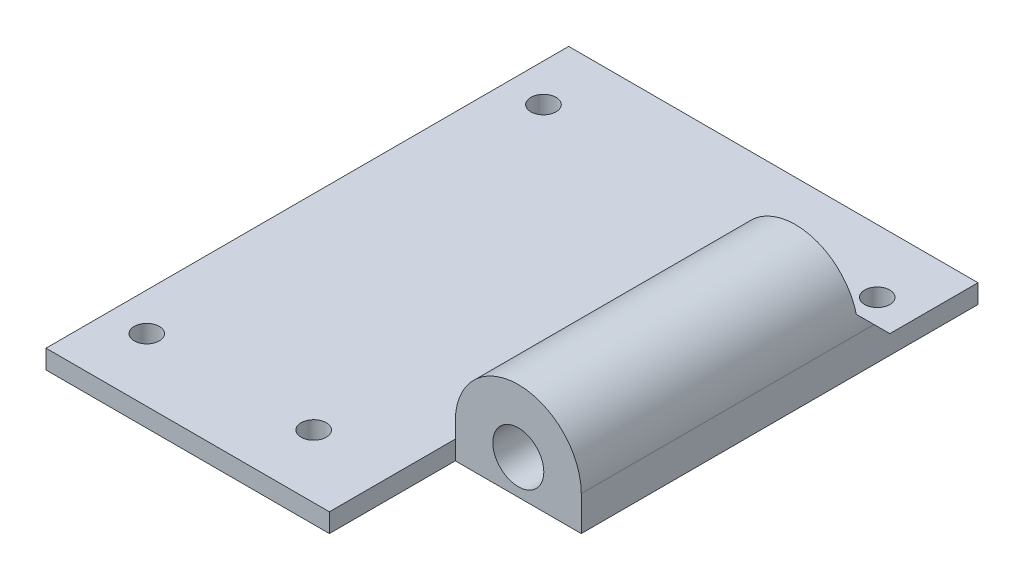
ISO-10303-21;
HEADER;
FILE_DESCRIPTION(('STEP AP214'),'2;1');
FILE_NAME('part.step','',(''),(''),'','','');
FILE_SCHEMA(('AUTOMOTIVE_DESIGN { 1 0 10303 214 1 1 1 1 }'));
ENDSEC;
DATA;
#1=APPLICATION_CONTEXT('core data for automotive mechanical design processes');
#2=APPLICATION_PROTOCOL_DEFINITION('international standard','automotive_design',2000,#1);
#3=PRODUCT_CONTEXT('',#1,'mechanical');
#4=PRODUCT('Part','Part','',(#3));
#5=PRODUCT_RELATED_PRODUCT_CATEGORY('part','',(#4));
#6=PRODUCT_DEFINITION_FORMATION('','',#4);
#7=PRODUCT_DEFINITION_CONTEXT('part definition',#1,'design');
#8=PRODUCT_DEFINITION('design','',#6,#7);
#9=PRODUCT_DEFINITION_SHAPE('','',#8);
#10=(LENGTH_UNIT() NAMED_UNIT(*) SI_UNIT(.MILLI.,.METRE.));
#11=(NAMED_UNIT(*) PLANE_ANGLE_UNIT() SI_UNIT($,.RADIAN.));
#12=(NAMED_UNIT(*) SI_UNIT($,.STERADIAN.) SOLID_ANGLE_UNIT());
#13=UNCERTAINTY_MEASURE_WITH_UNIT(LENGTH_MEASURE(1.E-05),#10,'distance_accuracy_value','');
#14=(GEOMETRIC_REPRESENTATION_CONTEXT(3) GLOBAL_UNCERTAINTY_ASSIGNED_CONTEXT((#13)) GLOBAL_UNIT_ASSIGNED_CONTEXT((#10,
#11,#12)) REPRESENTATION_CONTEXT('',''));
#15=CARTESIAN_POINT('',(0.,0.,0.));
#16=DIRECTION('',(0.,0.,1.));
#17=DIRECTION('',(1.,0.,0.));
#18=AXIS2_PLACEMENT_3D('',#15,#16,#17);
#19=CARTESIAN_POINT('',(0.,3.,0.));
#20=DIRECTION('',(1.,0.,0.));
#21=DIRECTION('',(0.,0.,-1.));
#22=AXIS2_PLACEMENT_3D('',#19,#20,#21);
#23=PLANE('',#22);
#24=DIRECTION('',(0.,0.,1.));
#25=VECTOR('',#24,1.);
#26=CARTESIAN_POINT('',(0.,0.,0.));
#27=LINE('',#26,#25);
#28=CARTESIAN_POINT('',(0.,0.,0.));
#29=VERTEX_POINT('',#28);
#30=CARTESIAN_POINT('',(0.,0.,83.));
#31=VERTEX_POINT('',#30);
#32=EDGE_CURVE('E162',#29,#31,#27,.T.);
#33=ORIENTED_EDGE('',*,*,#32,.T.);
#34=DIRECTION('',(0.,-1.,0.));
#35=VECTOR('',#34,1.);
#36=CARTESIAN_POINT('',(0.,3.,83.));
#37=LINE('',#36,#35);
#38=CARTESIAN_POINT('',(0.,3.,83.));
#39=VERTEX_POINT('',#38);
#40=EDGE_CURVE('E185',#39,#31,#37,.T.);
#41=ORIENTED_EDGE('',*,*,#40,.F.);
#42=DIRECTION('',(0.,0.,1.));
#43=VECTOR('',#42,1.);
#44=CARTESIAN_POINT('',(0.,3.,0.));
#45=LINE('',#44,#43);
#46=CARTESIAN_POINT('',(0.,3.,0.));
#47=VERTEX_POINT('',#46);
#48=EDGE_CURVE('E149',#47,#39,#45,.T.);
#49=ORIENTED_EDGE('',*,*,#48,.F.);
#50=DIRECTION('',(0.,-1.,0.));
#51=VECTOR('',#50,1.);
#52=CARTESIAN_POINT('',(0.,3.,0.));
#53=LINE('',#52,#51);
#54=EDGE_CURVE('E161',#47,#29,#53,.T.);
#55=ORIENTED_EDGE('',*,*,#54,.T.);
#56=EDGE_LOOP('',(#33,#41,#49,#55));
#57=FACE_BOUND('',#56,.T.);
#58=ADVANCED_FACE('F33',(#57),#23,.F.);
#59=CARTESIAN_POINT('',(0.,3.,83.));
#60=DIRECTION('',(0.,0.,-1.));
#61=DIRECTION('',(-1.,0.,0.));
#62=AXIS2_PLACEMENT_3D('',#59,#60,#61);
#63=PLANE('',#62);
#64=DIRECTION('',(1.,0.,0.));
#65=VECTOR('',#64,1.);
#66=CARTESIAN_POINT('',(0.,0.,83.));
#67=LINE('',#66,#65);
#68=CARTESIAN_POINT('',(45.,0.,83.));
#69=VERTEX_POINT('',#68);
#70=EDGE_CURVE('E165',#31,#69,#67,.T.);
#71=ORIENTED_EDGE('',*,*,#70,.T.);
#72=DIRECTION('',(0.,-1.,0.));
#73=VECTOR('',#72,1.);
#74=CARTESIAN_POINT('',(45.,3.,83.));
#75=LINE('',#74,#73);
#76=CARTESIAN_POINT('',(45.,3.,83.));
#77=VERTEX_POINT('',#76);
#78=EDGE_CURVE('E182',#77,#69,#75,.T.);
#79=ORIENTED_EDGE('',*,*,#78,.F.);
#80=DIRECTION('',(1.,0.,0.));
#81=VECTOR('',#80,1.);
#82=CARTESIAN_POINT('',(0.,3.,83.));
#83=LINE('',#82,#81);
#84=EDGE_CURVE('E152',#39,#77,#83,.T.);
#85=ORIENTED_EDGE('',*,*,#84,.F.);
#86=ORIENTED_EDGE('',*,*,#40,.T.);
#87=EDGE_LOOP('',(#71,#79,#85,#86));
#88=FACE_BOUND('',#87,.T.);
#89=ADVANCED_FACE('F228',(#88),#63,.F.);
#90=CARTESIAN_POINT('',(45.,3.,83.));
#91=DIRECTION('',(-1.,0.,0.));
#92=DIRECTION('',(0.,0.,1.));
#93=AXIS2_PLACEMENT_3D('',#90,#91,#92);
#94=PLANE('',#93);
#95=DIRECTION('',(0.,0.,-1.));
#96=VECTOR('',#95,1.);
#97=CARTESIAN_POINT('',(45.,0.,83.));
#98=LINE('',#97,#96);
#99=CARTESIAN_POINT('',(45.,0.,63.));
#100=VERTEX_POINT('',#99);
#101=EDGE_CURVE('E167',#69,#100,#98,.T.);
#102=ORIENTED_EDGE('',*,*,#101,.T.);
#103=DIRECTION('',(0.,-1.,0.));
#104=VECTOR('',#103,1.);
#105=CARTESIAN_POINT('',(45.,3.,63.));
#106=LINE('',#105,#104);
#107=CARTESIAN_POINT('',(45.,3.,63.));
#108=VERTEX_POINT('',#107);
#109=EDGE_CURVE('E180',#108,#100,#106,.T.);
#110=ORIENTED_EDGE('',*,*,#109,.F.);
#111=DIRECTION('',(0.,0.,-1.));
#112=VECTOR('',#111,1.);
#113=CARTESIAN_POINT('',(45.,3.,83.));
#114=LINE('',#113,#112);
#115=EDGE_CURVE('E155',#77,#108,#114,.T.);
#116=ORIENTED_EDGE('',*,*,#115,.F.);
#117=ORIENTED_EDGE('',*,*,#78,.T.);
#118=EDGE_LOOP('',(#102,#110,#116,#117));
#119=FACE_BOUND('',#118,.T.);
#120=ADVANCED_FACE('F233',(#119),#94,.F.);
#121=CARTESIAN_POINT('',(45.,3.,63.));
#122=DIRECTION('',(0.,0.,-1.));
#123=DIRECTION('',(-1.,0.,0.));
#124=AXIS2_PLACEMENT_3D('',#121,#122,#123);
#125=PLANE('',#124);
#126=CARTESIAN_POINT('',(55.,5.5,63.));
#127=DIRECTION('',(0.,0.,1.));
#128=DIRECTION('',(1.,0.,0.));
#129=AXIS2_PLACEMENT_3D('',#126,#127,#128);
#130=CIRCLE('',#129,4.05);
#131=CARTESIAN_POINT('',(59.05,5.5,63.));
#132=VERTEX_POINT('',#131);
#133=EDGE_CURVE('E127',#132,#132,#130,.T.);
#134=ORIENTED_EDGE('',*,*,#133,.F.);
#135=EDGE_LOOP('',(#134));
#136=FACE_BOUND('',#135,.T.);
#137=DIRECTION('',(1.,0.,0.));
#138=VECTOR('',#137,1.);
#139=CARTESIAN_POINT('',(45.,0.,63.));
#140=LINE('',#139,#138);
#141=CARTESIAN_POINT('',(65.,0.,63.));
#142=VERTEX_POINT('',#141);
#143=EDGE_CURVE('E169',#100,#142,#140,.T.);
#144=ORIENTED_EDGE('',*,*,#143,.T.);
#145=DIRECTION('',(0.,-1.,0.));
#146=VECTOR('',#145,1.);
#147=CARTESIAN_POINT('',(65.,3.,63.));
#148=LINE('',#147,#146);
#149=CARTESIAN_POINT('',(65.,5.5,63.));
#150=VERTEX_POINT('',#149);
#151=EDGE_CURVE('E123',#150,#142,#148,.T.);
#152=ORIENTED_EDGE('',*,*,#151,.F.);
#153=CARTESIAN_POINT('',(55.,5.5,63.));
#154=DIRECTION('',(0.,0.,1.));
#155=DIRECTION('',(1.,0.,0.));
#156=AXIS2_PLACEMENT_3D('',#153,#154,#155);
#157=CIRCLE('',#156,9.99999999999999);
#158=CARTESIAN_POINT('',(45.,5.5,63.));
#159=VERTEX_POINT('',#158);
#160=EDGE_CURVE('E114',#159,#150,#157,.F.);
#161=ORIENTED_EDGE('',*,*,#160,.F.);
#162=DIRECTION('',(0.,1.,0.));
#163=VECTOR('',#162,1.);
#164=CARTESIAN_POINT('',(45.,0.,63.));
#165=LINE('',#164,#163);
#166=EDGE_CURVE('E107',#108,#159,#165,.T.);
#167=ORIENTED_EDGE('',*,*,#166,.F.);
#168=ORIENTED_EDGE('',*,*,#109,.T.);
#169=EDGE_LOOP('',(#144,#152,#161,#167,#168));
#170=FACE_BOUND('',#169,.T.);
#171=ADVANCED_FACE('F121',(#136,#170),#125,.F.);
#172=CARTESIAN_POINT('',(65.,3.,0.));
#173=DIRECTION('',(-1.,0.,0.));
#174=DIRECTION('',(0.,0.,1.));
#175=AXIS2_PLACEMENT_3D('',#172,#173,#174);
#176=PLANE('',#175);
#177=DIRECTION('',(0.,0.,-1.));
#178=VECTOR('',#177,1.);
#179=CARTESIAN_POINT('',(65.,0.,0.));
#180=LINE('',#179,#178);
#181=CARTESIAN_POINT('',(65.,0.,0.));
#182=VERTEX_POINT('',#181);
#183=EDGE_CURVE('E171',#142,#182,#180,.T.);
#184=ORIENTED_EDGE('',*,*,#183,.T.);
#185=DIRECTION('',(0.,-1.,0.));
#186=VECTOR('',#185,1.);
#187=CARTESIAN_POINT('',(65.,3.,0.));
#188=LINE('',#187,#186);
#189=CARTESIAN_POINT('',(65.,3.,0.));
#190=VERTEX_POINT('',#189);
#191=EDGE_CURVE('E176',#190,#182,#188,.T.);
#192=ORIENTED_EDGE('',*,*,#191,.F.);
#193=DIRECTION('',(0.,0.,-1.));
#194=VECTOR('',#193,1.);
#195=CARTESIAN_POINT('',(65.,3.,0.));
#196=LINE('',#195,#194);
#197=CARTESIAN_POINT('',(65.,3.,14.));
#198=VERTEX_POINT('',#197);
#199=EDGE_CURVE('E157',#198,#190,#196,.T.);
#200=ORIENTED_EDGE('',*,*,#199,.F.);
#201=DIRECTION('',(0.,0.707106781186551,0.707106781186544));
#202=VECTOR('',#201,1.);
#203=CARTESIAN_POINT('',(65.,-4.00000000000001,7.00000000000008));
#204=LINE('',#203,#202);
#205=CARTESIAN_POINT('',(65.,5.5,16.5));
#206=VERTEX_POINT('',#205);
#207=EDGE_CURVE('E41',#198,#206,#204,.T.);
#208=ORIENTED_EDGE('',*,*,#207,.T.);
#209=DIRECTION('',(0.,0.,1.));
#210=VECTOR('',#209,1.);
#211=CARTESIAN_POINT('',(65.,5.5,19.));
#212=LINE('',#211,#210);
#213=EDGE_CURVE('E47',#206,#150,#212,.T.);
#214=ORIENTED_EDGE('',*,*,#213,.T.);
#215=ORIENTED_EDGE('',*,*,#151,.T.);
#216=EDGE_LOOP('',(#184,#192,#200,#208,#214,#215));
#217=FACE_BOUND('',#216,.T.);
#218=ADVANCED_FACE('F208',(#217),#176,.F.);
#219=CARTESIAN_POINT('',(0.,3.,0.));
#220=DIRECTION('',(0.,0.,1.));
#221=DIRECTION('',(1.,0.,0.));
#222=AXIS2_PLACEMENT_3D('',#219,#220,#221);
#223=PLANE('',#222);
#224=DIRECTION('',(-1.,0.,0.));
#225=VECTOR('',#224,1.);
#226=CARTESIAN_POINT('',(0.,0.,0.));
#227=LINE('',#226,#225);
#228=EDGE_CURVE('E153',#182,#29,#227,.T.);
#229=ORIENTED_EDGE('',*,*,#228,.T.);
#230=ORIENTED_EDGE('',*,*,#54,.F.);
#231=DIRECTION('',(-1.,0.,0.));
#232=VECTOR('',#231,1.);
#233=CARTESIAN_POINT('',(0.,3.,0.));
#234=LINE('',#233,#232);
#235=EDGE_CURVE('E159',#190,#47,#234,.T.);
#236=ORIENTED_EDGE('',*,*,#235,.F.);
#237=ORIENTED_EDGE('',*,*,#191,.T.);
#238=EDGE_LOOP('',(#229,#230,#236,#237));
#239=FACE_BOUND('',#238,.T.);
#240=ADVANCED_FACE('F245',(#239),#223,.F.);
#241=CARTESIAN_POINT('',(0.,3.,0.));
#242=DIRECTION('',(0.,1.,0.));
#243=DIRECTION('',(0.,0.,1.));
#244=AXIS2_PLACEMENT_3D('',#241,#242,#243);
#245=PLANE('',#244);
#246=DIRECTION('',(0.,0.,1.));
#247=VECTOR('',#246,1.);
#248=CARTESIAN_POINT('',(45.,3.,19.));
#249=LINE('',#248,#247);
#250=CARTESIAN_POINT('',(45.,3.,14.));
#251=VERTEX_POINT('',#250);
#252=EDGE_CURVE('E109',#251,#108,#249,.T.);
#253=ORIENTED_EDGE('',*,*,#252,.F.);
#254=DIRECTION('',(1.,0.,0.));
#255=VECTOR('',#254,1.);
#256=CARTESIAN_POINT('',(0.,3.,14.));
#257=LINE('',#256,#255);
#258=EDGE_CURVE('E200',#251,#198,#257,.T.);
#259=ORIENTED_EDGE('',*,*,#258,.T.);
#260=ORIENTED_EDGE('',*,*,#199,.T.);
#261=ORIENTED_EDGE('',*,*,#235,.T.);
#262=ORIENTED_EDGE('',*,*,#48,.T.);
#263=ORIENTED_EDGE('',*,*,#84,.T.);
#264=ORIENTED_EDGE('',*,*,#115,.T.);
#265=EDGE_LOOP('',(#253,#259,#260,#261,#262,#263,#264));
#266=FACE_BOUND('',#265,.T.);
#267=CARTESIAN_POINT('',(59.,3.,10.));
#268=DIRECTION('',(0.,1.,0.));
#269=DIRECTION('',(0.,0.,1.));
#270=AXIS2_PLACEMENT_3D('',#267,#268,#269);
#271=CIRCLE('',#270,2.);
#272=CARTESIAN_POINT('',(59.,3.,12.));
#273=VERTEX_POINT('',#272);
#274=EDGE_CURVE('E135',#273,#273,#271,.T.);
#275=ORIENTED_EDGE('',*,*,#274,.F.);
#276=EDGE_LOOP('',(#275));
#277=FACE_BOUND('',#276,.T.);
#278=CARTESIAN_POINT('',(6.,3.,73.));
#279=DIRECTION('',(0.,1.,0.));
#280=DIRECTION('',(0.,0.,1.));
#281=AXIS2_PLACEMENT_3D('',#278,#279,#280);
#282=CIRCLE('',#281,2.);
#283=CARTESIAN_POINT('',(6.,3.,75.));
#284=VERTEX_POINT('',#283);
#285=EDGE_CURVE('E139',#284,#284,#282,.T.);
#286=ORIENTED_EDGE('',*,*,#285,.F.);
#287=EDGE_LOOP('',(#286));
#288=FACE_BOUND('',#287,.T.);
#289=CARTESIAN_POINT('',(32.5,3.,73.));
#290=DIRECTION('',(0.,1.,0.));
#291=DIRECTION('',(0.,0.,1.));
#292=AXIS2_PLACEMENT_3D('',#289,#290,#291);
#293=CIRCLE('',#292,2.);
#294=CARTESIAN_POINT('',(32.5,3.,75.));
#295=VERTEX_POINT('',#294);
#296=EDGE_CURVE('E133',#295,#295,#293,.T.);
#297=ORIENTED_EDGE('',*,*,#296,.F.);
#298=EDGE_LOOP('',(#297));
#299=FACE_BOUND('',#298,.T.);
#300=CARTESIAN_POINT('',(6.,3.,10.));
#301=DIRECTION('',(0.,1.,0.));
#302=DIRECTION('',(0.,0.,1.));
#303=AXIS2_PLACEMENT_3D('',#300,#301,#302);
#304=CIRCLE('',#303,2.);
#305=CARTESIAN_POINT('',(6.,3.,12.));
#306=VERTEX_POINT('',#305);
#307=EDGE_CURVE('E144',#306,#306,#304,.T.);
#308=ORIENTED_EDGE('',*,*,#307,.F.);
#309=EDGE_LOOP('',(#308));
#310=FACE_BOUND('',#309,.T.);
#311=ADVANCED_FACE('F248',(#266,#277,#288,#299,#310),#245,.T.);
#312=CARTESIAN_POINT('',(0.,0.,0.));
#313=DIRECTION('',(0.,1.,0.));
#314=DIRECTION('',(0.,0.,1.));
#315=AXIS2_PLACEMENT_3D('',#312,#313,#314);
#316=PLANE('',#315);
#317=CARTESIAN_POINT('',(59.,0.,10.));
#318=DIRECTION('',(0.,1.,0.));
#319=DIRECTION('',(0.,0.,1.));
#320=AXIS2_PLACEMENT_3D('',#317,#318,#319);
#321=CIRCLE('',#320,2.);
#322=CARTESIAN_POINT('',(59.,0.,12.));
#323=VERTEX_POINT('',#322);
#324=EDGE_CURVE('E148',#323,#323,#321,.T.);
#325=ORIENTED_EDGE('',*,*,#324,.T.);
#326=EDGE_LOOP('',(#325));
#327=FACE_BOUND('',#326,.T.);
#328=CARTESIAN_POINT('',(6.,0.,73.));
#329=DIRECTION('',(0.,1.,0.));
#330=DIRECTION('',(0.,0.,1.));
#331=AXIS2_PLACEMENT_3D('',#328,#329,#330);
#332=CIRCLE('',#331,2.);
#333=CARTESIAN_POINT('',(6.,0.,75.));
#334=VERTEX_POINT('',#333);
#335=EDGE_CURVE('E193',#334,#334,#332,.T.);
#336=ORIENTED_EDGE('',*,*,#335,.T.);
#337=EDGE_LOOP('',(#336));
#338=FACE_BOUND('',#337,.T.);
#339=CARTESIAN_POINT('',(32.5,0.,73.));
#340=DIRECTION('',(0.,1.,0.));
#341=DIRECTION('',(0.,0.,1.));
#342=AXIS2_PLACEMENT_3D('',#339,#340,#341);
#343=CIRCLE('',#342,2.);
#344=CARTESIAN_POINT('',(32.5,0.,75.));
#345=VERTEX_POINT('',#344);
#346=EDGE_CURVE('E138',#345,#345,#343,.T.);
#347=ORIENTED_EDGE('',*,*,#346,.T.);
#348=EDGE_LOOP('',(#347));
#349=FACE_BOUND('',#348,.T.);
#350=CARTESIAN_POINT('',(6.,0.,10.));
#351=DIRECTION('',(0.,1.,0.));
#352=DIRECTION('',(0.,0.,1.));
#353=AXIS2_PLACEMENT_3D('',#350,#351,#352);
#354=CIRCLE('',#353,2.);
#355=CARTESIAN_POINT('',(6.,0.,12.));
#356=VERTEX_POINT('',#355);
#357=EDGE_CURVE('E147',#356,#356,#354,.T.);
#358=ORIENTED_EDGE('',*,*,#357,.T.);
#359=EDGE_LOOP('',(#358));
#360=FACE_BOUND('',#359,.T.);
#361=ORIENTED_EDGE('',*,*,#32,.F.);
#362=ORIENTED_EDGE('',*,*,#228,.F.);
#363=ORIENTED_EDGE('',*,*,#183,.F.);
#364=ORIENTED_EDGE('',*,*,#143,.F.);
#365=ORIENTED_EDGE('',*,*,#101,.F.);
#366=ORIENTED_EDGE('',*,*,#70,.F.);
#367=EDGE_LOOP('',(#361,#362,#363,#364,#365,#366));
#368=FACE_BOUND('',#367,.T.);
#369=ADVANCED_FACE('F250',(#327,#338,#349,#360,#368),#316,.F.);
#370=CARTESIAN_POINT('',(6.,-2.,10.));
#371=DIRECTION('',(0.,1.,0.));
#372=DIRECTION('',(0.,0.,1.));
#373=AXIS2_PLACEMENT_3D('',#370,#371,#372);
#374=CYLINDRICAL_SURFACE('',#373,2.);
#375=ORIENTED_EDGE('',*,*,#307,.T.);
#376=EDGE_LOOP('',(#375));
#377=FACE_BOUND('',#376,.T.);
#378=ORIENTED_EDGE('',*,*,#357,.F.);
#379=EDGE_LOOP('',(#378));
#380=FACE_BOUND('',#379,.T.);
#381=ADVANCED_FACE('F253',(#377,#380),#374,.F.);
#382=CARTESIAN_POINT('',(32.5,-2.,73.));
#383=DIRECTION('',(0.,1.,0.));
#384=DIRECTION('',(0.,0.,1.));
#385=AXIS2_PLACEMENT_3D('',#382,#383,#384);
#386=CYLINDRICAL_SURFACE('',#385,2.);
#387=ORIENTED_EDGE('',*,*,#296,.T.);
#388=EDGE_LOOP('',(#387));
#389=FACE_BOUND('',#388,.T.);
#390=ORIENTED_EDGE('',*,*,#346,.F.);
#391=EDGE_LOOP('',(#390));
#392=FACE_BOUND('',#391,.T.);
#393=ADVANCED_FACE('F260',(#389,#392),#386,.F.);
#394=CARTESIAN_POINT('',(6.,-2.,73.));
#395=DIRECTION('',(0.,1.,0.));
#396=DIRECTION('',(0.,0.,1.));
#397=AXIS2_PLACEMENT_3D('',#394,#395,#396);
#398=CYLINDRICAL_SURFACE('',#397,2.);
#399=ORIENTED_EDGE('',*,*,#285,.T.);
#400=EDGE_LOOP('',(#399));
#401=FACE_BOUND('',#400,.T.);
#402=ORIENTED_EDGE('',*,*,#335,.F.);
#403=EDGE_LOOP('',(#402));
#404=FACE_BOUND('',#403,.T.);
#405=ADVANCED_FACE('F264',(#401,#404),#398,.F.);
#406=CARTESIAN_POINT('',(59.,-2.,10.));
#407=DIRECTION('',(0.,1.,0.));
#408=DIRECTION('',(0.,0.,1.));
#409=AXIS2_PLACEMENT_3D('',#406,#407,#408);
#410=CYLINDRICAL_SURFACE('',#409,2.);
#411=ORIENTED_EDGE('',*,*,#274,.T.);
#412=EDGE_LOOP('',(#411));
#413=FACE_BOUND('',#412,.T.);
#414=ORIENTED_EDGE('',*,*,#324,.F.);
#415=EDGE_LOOP('',(#414));
#416=FACE_BOUND('',#415,.T.);
#417=ADVANCED_FACE('F268',(#413,#416),#410,.F.);
#418=CARTESIAN_POINT('',(55.,5.5,19.));
#419=DIRECTION('',(0.,0.,1.));
#420=DIRECTION('',(1.,0.,0.));
#421=AXIS2_PLACEMENT_3D('',#418,#419,#420);
#422=CYLINDRICAL_SURFACE('',#421,9.99999999999999);
#423=ORIENTED_EDGE('',*,*,#160,.T.);
#424=ORIENTED_EDGE('',*,*,#213,.F.);
#425=CARTESIAN_POINT('',(55.,5.5,16.5));
#426=DIRECTION('',(0.,-0.707106781186544,0.707106781186551));
#427=DIRECTION('',(0.,0.707106781186551,0.707106781186544));
#428=AXIS2_PLACEMENT_3D('',#425,#426,#427);
#429=ELLIPSE('',#428,14.1421356237309,9.99999999999999);
#430=CARTESIAN_POINT('',(64.6824583655185,8.00000000000004,19.));
#431=VERTEX_POINT('',#430);
#432=EDGE_CURVE('E11',#206,#431,#429,.T.);
#433=ORIENTED_EDGE('',*,*,#432,.T.);
#434=CARTESIAN_POINT('',(55.,5.5,19.));
#435=DIRECTION('',(0.,0.,1.));
#436=DIRECTION('',(1.,0.,0.));
#437=AXIS2_PLACEMENT_3D('',#434,#435,#436);
#438=CIRCLE('',#437,9.99999999999999);
#439=CARTESIAN_POINT('',(45.3175416344815,8.00000000000004,19.));
#440=VERTEX_POINT('',#439);
#441=EDGE_CURVE('E113',#440,#431,#438,.F.);
#442=ORIENTED_EDGE('',*,*,#441,.F.);
#443=CARTESIAN_POINT('',(55.,5.5,16.5));
#444=DIRECTION('',(0.,-0.707106781186544,0.707106781186551));
#445=DIRECTION('',(0.,0.707106781186551,0.707106781186544));
#446=AXIS2_PLACEMENT_3D('',#443,#444,#445);
#447=ELLIPSE('',#446,14.1421356237309,9.99999999999999);
#448=CARTESIAN_POINT('',(45.,5.5,16.5));
#449=VERTEX_POINT('',#448);
#450=EDGE_CURVE('E118',#440,#449,#447,.T.);
#451=ORIENTED_EDGE('',*,*,#450,.T.);
#452=DIRECTION('',(0.,0.,1.));
#453=VECTOR('',#452,1.);
#454=CARTESIAN_POINT('',(45.,5.5,19.));
#455=LINE('',#454,#453);
#456=EDGE_CURVE('E55',#449,#159,#455,.T.);
#457=ORIENTED_EDGE('',*,*,#456,.T.);
#458=EDGE_LOOP('',(#423,#424,#433,#442,#451,#457));
#459=FACE_BOUND('',#458,.T.);
#460=ADVANCED_FACE('F116',(#459),#422,.T.);
#461=CARTESIAN_POINT('',(45.,0.,19.));
#462=DIRECTION('',(1.,0.,0.));
#463=DIRECTION('',(0.,0.,-1.));
#464=AXIS2_PLACEMENT_3D('',#461,#462,#463);
#465=PLANE('',#464);
#466=ORIENTED_EDGE('',*,*,#166,.T.);
#467=ORIENTED_EDGE('',*,*,#456,.F.);
#468=DIRECTION('',(0.,-0.707106781186551,-0.707106781186544));
#469=VECTOR('',#468,1.);
#470=CARTESIAN_POINT('',(45.,3.99999999999998,15.));
#471=LINE('',#470,#469);
#472=EDGE_CURVE('E203',#449,#251,#471,.T.);
#473=ORIENTED_EDGE('',*,*,#472,.T.);
#474=ORIENTED_EDGE('',*,*,#252,.T.);
#475=EDGE_LOOP('',(#466,#467,#473,#474));
#476=FACE_BOUND('',#475,.T.);
#477=ADVANCED_FACE('F108',(#476),#465,.F.);
#478=CARTESIAN_POINT('',(0.,0.,19.));
#479=DIRECTION('',(0.,0.,1.));
#480=DIRECTION('',(1.,0.,0.));
#481=AXIS2_PLACEMENT_3D('',#478,#479,#480);
#482=PLANE('',#481);
#483=ORIENTED_EDGE('',*,*,#441,.T.);
#484=DIRECTION('',(-1.,0.,0.));
#485=VECTOR('',#484,1.);
#486=CARTESIAN_POINT('',(0.,8.00000000000004,19.));
#487=LINE('',#486,#485);
#488=EDGE_CURVE('E188',#431,#440,#487,.T.);
#489=ORIENTED_EDGE('',*,*,#488,.T.);
#490=EDGE_LOOP('',(#483,#489));
#491=FACE_BOUND('',#490,.T.);
#492=ADVANCED_FACE('F215',(#491),#482,.F.);
#493=CARTESIAN_POINT('',(55.,5.5,23.));
#494=DIRECTION('',(0.,0.,1.));
#495=DIRECTION('',(1.,0.,0.));
#496=AXIS2_PLACEMENT_3D('',#493,#494,#495);
#497=CYLINDRICAL_SURFACE('',#496,4.05);
#498=CARTESIAN_POINT('',(55.,5.5,23.));
#499=DIRECTION('',(0.,0.,1.));
#500=DIRECTION('',(1.,0.,0.));
#501=AXIS2_PLACEMENT_3D('',#498,#499,#500);
#502=CIRCLE('',#501,4.05);
#503=CARTESIAN_POINT('',(59.05,5.5,23.));
#504=VERTEX_POINT('',#503);
#505=EDGE_CURVE('E124',#504,#504,#502,.T.);
#506=ORIENTED_EDGE('',*,*,#505,.F.);
#507=EDGE_LOOP('',(#506));
#508=FACE_BOUND('',#507,.T.);
#509=ORIENTED_EDGE('',*,*,#133,.T.);
#510=EDGE_LOOP('',(#509));
#511=FACE_BOUND('',#510,.T.);
#512=ADVANCED_FACE('F217',(#508,#511),#497,.F.);
#513=CARTESIAN_POINT('',(55.,5.5,23.));
#514=DIRECTION('',(0.,0.,1.));
#515=DIRECTION('',(1.,0.,0.));
#516=AXIS2_PLACEMENT_3D('',#513,#514,#515);
#517=PLANE('',#516);
#518=ORIENTED_EDGE('',*,*,#505,.T.);
#519=EDGE_LOOP('',(#518));
#520=FACE_BOUND('',#519,.T.);
#521=ADVANCED_FACE('F223',(#520),#517,.T.);
#522=CARTESIAN_POINT('',(0.,8.00000000000004,19.));
#523=DIRECTION('',(0.,-0.707106781186544,0.707106781186551));
#524=DIRECTION('',(-1.,0.,0.));
#525=AXIS2_PLACEMENT_3D('',#522,#523,#524);
#526=PLANE('',#525);
#527=ORIENTED_EDGE('',*,*,#207,.F.);
#528=ORIENTED_EDGE('',*,*,#258,.F.);
#529=ORIENTED_EDGE('',*,*,#472,.F.);
#530=ORIENTED_EDGE('',*,*,#450,.F.);
#531=ORIENTED_EDGE('',*,*,#488,.F.);
#532=ORIENTED_EDGE('',*,*,#432,.F.);
#533=EDGE_LOOP('',(#527,#528,#529,#530,#531,#532));
#534=FACE_BOUND('',#533,.T.);
#535=ADVANCED_FACE('F35',(#534),#526,.F.);
#536=CLOSED_SHELL('',(#58,#89,#120,#171,#218,#240,#311,#369,#381,#393,#405,#417,#460,#477,#492,
#512,#521,#535));
#537=MANIFOLD_SOLID_BREP('B2',#536);
#538=ADVANCED_BREP_SHAPE_REPRESENTATION('',(#18,#537),#14);
#539=SHAPE_DEFINITION_REPRESENTATION(#9,#538);
ENDSEC;
END-ISO-10303-21;
